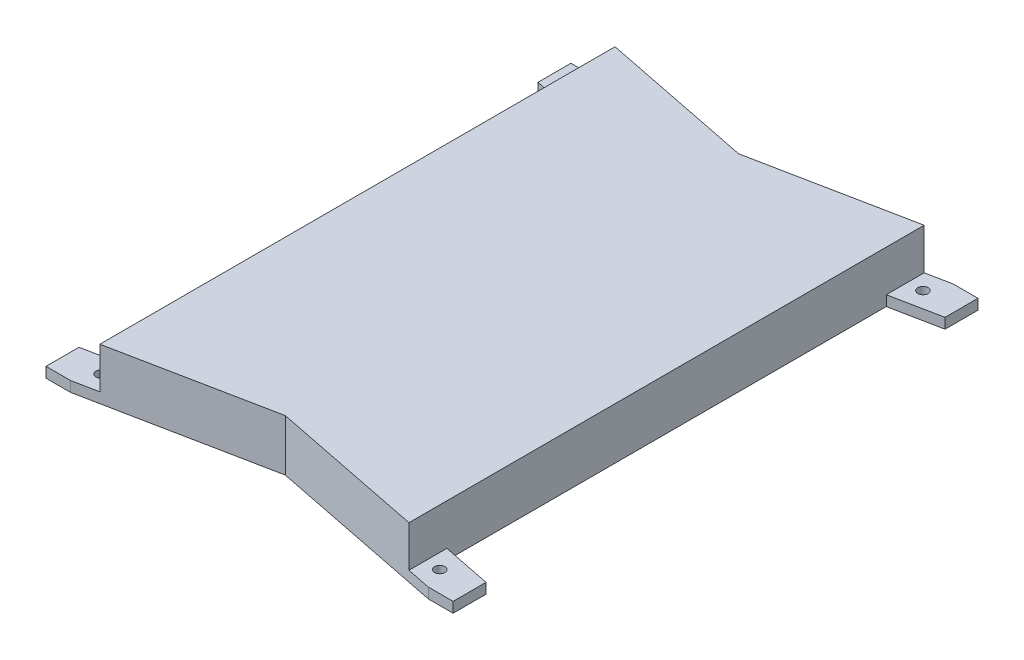
ISO-10303-21;
HEADER;
FILE_DESCRIPTION(('STEP AP214'),'2;1');
FILE_NAME('part.step','',(''),(''),'','','');
FILE_SCHEMA(('AUTOMOTIVE_DESIGN { 1 0 10303 214 1 1 1 1 }'));
ENDSEC;
DATA;
#1=APPLICATION_CONTEXT('core data for automotive mechanical design processes');
#2=APPLICATION_PROTOCOL_DEFINITION('international standard','automotive_design',2000,#1);
#3=PRODUCT_CONTEXT('',#1,'mechanical');
#4=PRODUCT('Part','Part','',(#3));
#5=PRODUCT_RELATED_PRODUCT_CATEGORY('part','',(#4));
#6=PRODUCT_DEFINITION_FORMATION('','',#4);
#7=PRODUCT_DEFINITION_CONTEXT('part definition',#1,'design');
#8=PRODUCT_DEFINITION('design','',#6,#7);
#9=PRODUCT_DEFINITION_SHAPE('','',#8);
#10=(LENGTH_UNIT() NAMED_UNIT(*) SI_UNIT(.MILLI.,.METRE.));
#11=(NAMED_UNIT(*) PLANE_ANGLE_UNIT() SI_UNIT($,.RADIAN.));
#12=(NAMED_UNIT(*) SI_UNIT($,.STERADIAN.) SOLID_ANGLE_UNIT());
#13=UNCERTAINTY_MEASURE_WITH_UNIT(LENGTH_MEASURE(1.E-05),#10,'distance_accuracy_value','');
#14=(GEOMETRIC_REPRESENTATION_CONTEXT(3) GLOBAL_UNCERTAINTY_ASSIGNED_CONTEXT((#13)) GLOBAL_UNIT_ASSIGNED_CONTEXT((#10,
#11,#12)) REPRESENTATION_CONTEXT('',''));
#15=CARTESIAN_POINT('',(0.,0.,0.));
#16=DIRECTION('',(0.,0.,1.));
#17=DIRECTION('',(1.,0.,0.));
#18=AXIS2_PLACEMENT_3D('',#15,#16,#17);
#19=CARTESIAN_POINT('',(-73.,0.,0.));
#20=DIRECTION('',(-1.,0.,0.));
#21=DIRECTION('',(0.,0.,1.));
#22=AXIS2_PLACEMENT_3D('',#19,#20,#21);
#23=PLANE('',#22);
#24=DIRECTION('',(0.,0.,-1.));
#25=VECTOR('',#24,1.);
#26=CARTESIAN_POINT('',(-73.,20.,0.));
#27=LINE('',#26,#25);
#28=CARTESIAN_POINT('',(-73.,20.,122.560392194563));
#29=VERTEX_POINT('',#28);
#30=CARTESIAN_POINT('',(-73.,20.,-122.560392194563));
#31=VERTEX_POINT('',#30);
#32=EDGE_CURVE('E243',#29,#31,#27,.T.);
#33=ORIENTED_EDGE('',*,*,#32,.F.);
#34=DIRECTION('',(0.,1.,0.));
#35=VECTOR('',#34,1.);
#36=CARTESIAN_POINT('',(-73.,0.,122.560392194563));
#37=LINE('',#36,#35);
#38=CARTESIAN_POINT('',(-73.,0.,122.560392194563));
#39=VERTEX_POINT('',#38);
#40=EDGE_CURVE('E228',#39,#29,#37,.T.);
#41=ORIENTED_EDGE('',*,*,#40,.F.);
#42=DIRECTION('',(0.,0.,1.));
#43=VECTOR('',#42,1.);
#44=CARTESIAN_POINT('',(-73.,0.,0.));
#45=LINE('',#44,#43);
#46=CARTESIAN_POINT('',(-73.,0.,-122.560392194563));
#47=VERTEX_POINT('',#46);
#48=EDGE_CURVE('E312',#47,#39,#45,.T.);
#49=ORIENTED_EDGE('',*,*,#48,.F.);
#50=DIRECTION('',(0.,1.,0.));
#51=VECTOR('',#50,1.);
#52=CARTESIAN_POINT('',(-73.,0.,-122.560392194563));
#53=LINE('',#52,#51);
#54=EDGE_CURVE('E244',#47,#31,#53,.T.);
#55=ORIENTED_EDGE('',*,*,#54,.T.);
#56=EDGE_LOOP('',(#33,#41,#49,#55));
#57=FACE_BOUND('',#56,.T.);
#58=ADVANCED_FACE('F42',(#57),#23,.F.);
#59=CARTESIAN_POINT('',(20.7616138835697,0.,-103.808069417849));
#60=DIRECTION('',(0.196116135138183,0.,-0.98058067569092));
#61=DIRECTION('',(-0.98058067569092,0.,-0.196116135138183));
#62=AXIS2_PLACEMENT_3D('',#59,#60,#61);
#63=PLANE('',#62);
#64=DIRECTION('',(0.98058067569092,0.,0.196116135138183));
#65=VECTOR('',#64,1.);
#66=CARTESIAN_POINT('',(20.7616138835697,20.,-103.808069417849));
#67=LINE('',#66,#65);
#68=CARTESIAN_POINT('',(0.,20.,-107.960392194563));
#69=VERTEX_POINT('',#68);
#70=EDGE_CURVE('E58',#31,#69,#67,.T.);
#71=ORIENTED_EDGE('',*,*,#70,.F.);
#72=ORIENTED_EDGE('',*,*,#54,.F.);
#73=DIRECTION('',(-0.98058067569092,0.,-0.196116135138183));
#74=VECTOR('',#73,1.);
#75=CARTESIAN_POINT('',(20.7616138835697,0.,-103.808069417849));
#76=LINE('',#75,#74);
#77=CARTESIAN_POINT('',(0.,0.,-107.960392194563));
#78=VERTEX_POINT('',#77);
#79=EDGE_CURVE('E240',#78,#47,#76,.T.);
#80=ORIENTED_EDGE('',*,*,#79,.F.);
#81=DIRECTION('',(0.,1.,0.));
#82=VECTOR('',#81,1.);
#83=CARTESIAN_POINT('',(0.,0.,-107.960392194563));
#84=LINE('',#83,#82);
#85=EDGE_CURVE('E361',#78,#69,#84,.T.);
#86=ORIENTED_EDGE('',*,*,#85,.T.);
#87=EDGE_LOOP('',(#71,#72,#80,#86));
#88=FACE_BOUND('',#87,.T.);
#89=ADVANCED_FACE('F660',(#88),#63,.F.);
#90=CARTESIAN_POINT('',(-20.7616138835697,0.,-103.808069417849));
#91=DIRECTION('',(-0.196116135138183,0.,-0.98058067569092));
#92=DIRECTION('',(-0.98058067569092,0.,0.196116135138183));
#93=AXIS2_PLACEMENT_3D('',#90,#91,#92);
#94=PLANE('',#93);
#95=DIRECTION('',(0.98058067569092,0.,-0.196116135138183));
#96=VECTOR('',#95,1.);
#97=CARTESIAN_POINT('',(-20.7616138835697,20.,-103.808069417849));
#98=LINE('',#97,#96);
#99=CARTESIAN_POINT('',(72.9999999999999,20.,-122.560392194563));
#100=VERTEX_POINT('',#99);
#101=EDGE_CURVE('E66',#69,#100,#98,.T.);
#102=ORIENTED_EDGE('',*,*,#101,.F.);
#103=ORIENTED_EDGE('',*,*,#85,.F.);
#104=DIRECTION('',(-0.98058067569092,0.,0.196116135138183));
#105=VECTOR('',#104,1.);
#106=CARTESIAN_POINT('',(-20.7616138835697,0.,-103.808069417849));
#107=LINE('',#106,#105);
#108=CARTESIAN_POINT('',(72.9999999999999,0.,-122.560392194563));
#109=VERTEX_POINT('',#108);
#110=EDGE_CURVE('E351',#109,#78,#107,.T.);
#111=ORIENTED_EDGE('',*,*,#110,.F.);
#112=DIRECTION('',(0.,1.,0.));
#113=VECTOR('',#112,1.);
#114=CARTESIAN_POINT('',(72.9999999999999,0.,-122.560392194563));
#115=LINE('',#114,#113);
#116=EDGE_CURVE('E364',#109,#100,#115,.T.);
#117=ORIENTED_EDGE('',*,*,#116,.T.);
#118=EDGE_LOOP('',(#102,#103,#111,#117));
#119=FACE_BOUND('',#118,.T.);
#120=ADVANCED_FACE('F665',(#119),#94,.F.);
#121=CARTESIAN_POINT('',(73.,0.,0.));
#122=DIRECTION('',(-1.,0.,0.));
#123=DIRECTION('',(0.,0.,1.));
#124=AXIS2_PLACEMENT_3D('',#121,#122,#123);
#125=PLANE('',#124);
#126=DIRECTION('',(0.,1.,0.));
#127=VECTOR('',#126,1.);
#128=CARTESIAN_POINT('',(73.,0.,122.560392194563));
#129=LINE('',#128,#127);
#130=CARTESIAN_POINT('',(73.,0.,122.560392194563));
#131=VERTEX_POINT('',#130);
#132=CARTESIAN_POINT('',(73.,20.,122.560392194563));
#133=VERTEX_POINT('',#132);
#134=EDGE_CURVE('E367',#131,#133,#129,.T.);
#135=ORIENTED_EDGE('',*,*,#134,.T.);
#136=DIRECTION('',(0.,0.,-1.));
#137=VECTOR('',#136,1.);
#138=CARTESIAN_POINT('',(73.,20.,0.));
#139=LINE('',#138,#137);
#140=EDGE_CURVE('E253',#133,#100,#139,.T.);
#141=ORIENTED_EDGE('',*,*,#140,.T.);
#142=ORIENTED_EDGE('',*,*,#116,.F.);
#143=DIRECTION('',(0.,0.,1.));
#144=VECTOR('',#143,1.);
#145=CARTESIAN_POINT('',(73.,0.,0.));
#146=LINE('',#145,#144);
#147=EDGE_CURVE('E348',#109,#131,#146,.T.);
#148=ORIENTED_EDGE('',*,*,#147,.T.);
#149=EDGE_LOOP('',(#135,#141,#142,#148));
#150=FACE_BOUND('',#149,.T.);
#151=ADVANCED_FACE('F855',(#150),#125,.T.);
#152=CARTESIAN_POINT('',(-20.7616138835698,0.,103.808069417849));
#153=DIRECTION('',(-0.196116135138185,0.,0.98058067569092));
#154=DIRECTION('',(0.98058067569092,0.,0.196116135138185));
#155=AXIS2_PLACEMENT_3D('',#152,#153,#154);
#156=PLANE('',#155);
#157=DIRECTION('',(-0.98058067569092,0.,-0.196116135138185));
#158=VECTOR('',#157,1.);
#159=CARTESIAN_POINT('',(-20.7616138835698,20.,103.808069417849));
#160=LINE('',#159,#158);
#161=CARTESIAN_POINT('',(0.,20.,107.960392194563));
#162=VERTEX_POINT('',#161);
#163=EDGE_CURVE('E252',#133,#162,#160,.T.);
#164=ORIENTED_EDGE('',*,*,#163,.F.);
#165=ORIENTED_EDGE('',*,*,#134,.F.);
#166=DIRECTION('',(0.98058067569092,0.,0.196116135138185));
#167=VECTOR('',#166,1.);
#168=CARTESIAN_POINT('',(-20.7616138835698,0.,103.808069417849));
#169=LINE('',#168,#167);
#170=CARTESIAN_POINT('',(0.,0.,107.960392194563));
#171=VERTEX_POINT('',#170);
#172=EDGE_CURVE('E344',#171,#131,#169,.T.);
#173=ORIENTED_EDGE('',*,*,#172,.F.);
#174=DIRECTION('',(0.,1.,0.));
#175=VECTOR('',#174,1.);
#176=CARTESIAN_POINT('',(0.,0.,107.960392194563));
#177=LINE('',#176,#175);
#178=EDGE_CURVE('E239',#171,#162,#177,.T.);
#179=ORIENTED_EDGE('',*,*,#178,.T.);
#180=EDGE_LOOP('',(#164,#165,#173,#179));
#181=FACE_BOUND('',#180,.T.);
#182=ADVANCED_FACE('F866',(#181),#156,.F.);
#183=CARTESIAN_POINT('',(20.7616138835697,0.,103.808069417849));
#184=DIRECTION('',(0.196116135138183,0.,0.98058067569092));
#185=DIRECTION('',(0.98058067569092,0.,-0.196116135138183));
#186=AXIS2_PLACEMENT_3D('',#183,#184,#185);
#187=PLANE('',#186);
#188=DIRECTION('',(-0.98058067569092,0.,0.196116135138183));
#189=VECTOR('',#188,1.);
#190=CARTESIAN_POINT('',(20.7616138835697,20.,103.808069417849));
#191=LINE('',#190,#189);
#192=EDGE_CURVE('E11',#162,#29,#191,.T.);
#193=ORIENTED_EDGE('',*,*,#192,.F.);
#194=ORIENTED_EDGE('',*,*,#178,.F.);
#195=DIRECTION('',(0.98058067569092,0.,-0.196116135138183));
#196=VECTOR('',#195,1.);
#197=CARTESIAN_POINT('',(20.7616138835697,0.,103.808069417849));
#198=LINE('',#197,#196);
#199=EDGE_CURVE('E234',#39,#171,#198,.T.);
#200=ORIENTED_EDGE('',*,*,#199,.F.);
#201=ORIENTED_EDGE('',*,*,#40,.T.);
#202=EDGE_LOOP('',(#193,#194,#200,#201));
#203=FACE_BOUND('',#202,.T.);
#204=ADVANCED_FACE('F230',(#203),#187,.F.);
#205=CARTESIAN_POINT('',(0.,5.,0.));
#206=DIRECTION('',(0.,1.,0.));
#207=DIRECTION('',(0.,0.,1.));
#208=AXIS2_PLACEMENT_3D('',#205,#206,#207);
#209=PLANE('',#208);
#210=DIRECTION('',(0.,0.,-1.));
#211=VECTOR('',#210,1.);
#212=CARTESIAN_POINT('',(74.9999999999999,5.,-125.));
#213=LINE('',#212,#211);
#214=CARTESIAN_POINT('',(75.,5.,125.));
#215=VERTEX_POINT('',#214);
#216=CARTESIAN_POINT('',(75.,5.,106.6));
#217=VERTEX_POINT('',#216);
#218=EDGE_CURVE('E271',#215,#217,#213,.T.);
#219=ORIENTED_EDGE('',*,*,#218,.F.);
#220=DIRECTION('',(0.98058067569092,0.,0.196116135138184));
#221=VECTOR('',#220,1.);
#222=CARTESIAN_POINT('',(0.,5.,110.));
#223=LINE('',#222,#221);
#224=CARTESIAN_POINT('',(86.766968108291,5.,127.353393621658));
#225=VERTEX_POINT('',#224);
#226=EDGE_CURVE('E398',#215,#225,#223,.T.);
#227=ORIENTED_EDGE('',*,*,#226,.T.);
#228=DIRECTION('',(1.,0.,0.));
#229=VECTOR('',#228,1.);
#230=CARTESIAN_POINT('',(86.766968108291,5.,127.353393621658));
#231=LINE('',#230,#229);
#232=CARTESIAN_POINT('',(98.766968108291,5.,127.353393621658));
#233=VERTEX_POINT('',#232);
#234=EDGE_CURVE('E401',#225,#233,#231,.T.);
#235=ORIENTED_EDGE('',*,*,#234,.T.);
#236=DIRECTION('',(0.,0.,-1.));
#237=VECTOR('',#236,1.);
#238=CARTESIAN_POINT('',(98.766968108291,5.,127.353393621658));
#239=LINE('',#238,#237);
#240=CARTESIAN_POINT('',(98.766968108291,5.,111.353393621658));
#241=VERTEX_POINT('',#240);
#242=EDGE_CURVE('E404',#233,#241,#239,.T.);
#243=ORIENTED_EDGE('',*,*,#242,.T.);
#244=DIRECTION('',(-0.980580675690919,0.,-0.196116135138188));
#245=VECTOR('',#244,1.);
#246=CARTESIAN_POINT('',(98.766968108291,5.,111.353393621658));
#247=LINE('',#246,#245);
#248=EDGE_CURVE('E407',#241,#217,#247,.T.);
#249=ORIENTED_EDGE('',*,*,#248,.T.);
#250=EDGE_LOOP('',(#219,#227,#235,#243,#249));
#251=FACE_BOUND('',#250,.T.);
#252=CARTESIAN_POINT('',(82.1768461758862,5.,117.235369235177));
#253=DIRECTION('',(0.,1.,0.));
#254=DIRECTION('',(0.,0.,1.));
#255=AXIS2_PLACEMENT_3D('',#252,#253,#254);
#256=CIRCLE('',#255,2.50000000000001);
#257=CARTESIAN_POINT('',(82.1768461758862,5.,119.735369235177));
#258=VERTEX_POINT('',#257);
#259=EDGE_CURVE('E321',#258,#258,#256,.T.);
#260=ORIENTED_EDGE('',*,*,#259,.F.);
#261=EDGE_LOOP('',(#260));
#262=FACE_BOUND('',#261,.T.);
#263=ADVANCED_FACE('F627',(#251,#262),#209,.T.);
#264=CARTESIAN_POINT('',(75.,5.,-106.6));
#265=VERTEX_POINT('',#264);
#266=CARTESIAN_POINT('',(74.9999999999999,5.,-125.));
#267=VERTEX_POINT('',#266);
#268=EDGE_CURVE('E51',#265,#267,#213,.T.);
#269=ORIENTED_EDGE('',*,*,#268,.F.);
#270=DIRECTION('',(0.98058067569092,0.,-0.196116135138183));
#271=VECTOR('',#270,1.);
#272=CARTESIAN_POINT('',(98.7669681082911,5.,-111.353393621658));
#273=LINE('',#272,#271);
#274=CARTESIAN_POINT('',(98.7669681082911,5.,-111.353393621658));
#275=VERTEX_POINT('',#274);
#276=EDGE_CURVE('E410',#265,#275,#273,.T.);
#277=ORIENTED_EDGE('',*,*,#276,.T.);
#278=DIRECTION('',(0.,0.,-1.));
#279=VECTOR('',#278,1.);
#280=CARTESIAN_POINT('',(98.7669681082911,5.,-127.353393621658));
#281=LINE('',#280,#279);
#282=CARTESIAN_POINT('',(98.7669681082911,5.,-127.353393621658));
#283=VERTEX_POINT('',#282);
#284=EDGE_CURVE('E413',#275,#283,#281,.T.);
#285=ORIENTED_EDGE('',*,*,#284,.T.);
#286=DIRECTION('',(-1.,0.,0.));
#287=VECTOR('',#286,1.);
#288=CARTESIAN_POINT('',(86.7669681082911,5.,-127.353393621658));
#289=LINE('',#288,#287);
#290=CARTESIAN_POINT('',(86.7669681082911,5.,-127.353393621658));
#291=VERTEX_POINT('',#290);
#292=EDGE_CURVE('E416',#283,#291,#289,.T.);
#293=ORIENTED_EDGE('',*,*,#292,.T.);
#294=DIRECTION('',(-0.980580675690921,0.,0.196116135138179));
#295=VECTOR('',#294,1.);
#296=CARTESIAN_POINT('',(75.,5.,-125.));
#297=LINE('',#296,#295);
#298=EDGE_CURVE('E419',#291,#267,#297,.T.);
#299=ORIENTED_EDGE('',*,*,#298,.T.);
#300=EDGE_LOOP('',(#269,#277,#285,#293,#299));
#301=FACE_BOUND('',#300,.T.);
#302=CARTESIAN_POINT('',(82.1768461758862,5.,-117.235369235177));
#303=DIRECTION('',(0.,1.,0.));
#304=DIRECTION('',(0.,0.,1.));
#305=AXIS2_PLACEMENT_3D('',#302,#303,#304);
#306=CIRCLE('',#305,2.50000000000001);
#307=CARTESIAN_POINT('',(82.1768461758862,5.,-114.735369235177));
#308=VERTEX_POINT('',#307);
#309=EDGE_CURVE('E307',#308,#308,#306,.F.);
#310=ORIENTED_EDGE('',*,*,#309,.T.);
#311=EDGE_LOOP('',(#310));
#312=FACE_BOUND('',#311,.T.);
#313=ADVANCED_FACE('F565',(#301,#312),#209,.T.);
#314=DIRECTION('',(0.,0.,1.));
#315=VECTOR('',#314,1.);
#316=CARTESIAN_POINT('',(-75.,5.,-125.));
#317=LINE('',#316,#315);
#318=CARTESIAN_POINT('',(-75.,5.,-125.));
#319=VERTEX_POINT('',#318);
#320=CARTESIAN_POINT('',(-75.,5.,-106.6));
#321=VERTEX_POINT('',#320);
#322=EDGE_CURVE('E247',#319,#321,#317,.T.);
#323=ORIENTED_EDGE('',*,*,#322,.F.);
#324=DIRECTION('',(-0.980580675690921,0.,-0.196116135138177));
#325=VECTOR('',#324,1.);
#326=CARTESIAN_POINT('',(-75.,5.,-125.));
#327=LINE('',#326,#325);
#328=CARTESIAN_POINT('',(-86.7669681082911,5.,-127.353393621658));
#329=VERTEX_POINT('',#328);
#330=EDGE_CURVE('E372',#319,#329,#327,.T.);
#331=ORIENTED_EDGE('',*,*,#330,.T.);
#332=DIRECTION('',(-1.,0.,0.));
#333=VECTOR('',#332,1.);
#334=CARTESIAN_POINT('',(-86.7669681082911,5.,-127.353393621658));
#335=LINE('',#334,#333);
#336=CARTESIAN_POINT('',(-98.7669681082911,5.,-127.353393621658));
#337=VERTEX_POINT('',#336);
#338=EDGE_CURVE('E375',#329,#337,#335,.T.);
#339=ORIENTED_EDGE('',*,*,#338,.T.);
#340=DIRECTION('',(0.,0.,1.));
#341=VECTOR('',#340,1.);
#342=CARTESIAN_POINT('',(-98.7669681082911,5.,-127.353393621658));
#343=LINE('',#342,#341);
#344=CARTESIAN_POINT('',(-98.7669681082911,5.,-111.353393621658));
#345=VERTEX_POINT('',#344);
#346=EDGE_CURVE('E379',#337,#345,#343,.T.);
#347=ORIENTED_EDGE('',*,*,#346,.T.);
#348=DIRECTION('',(0.980580675690921,0.,0.196116135138183));
#349=VECTOR('',#348,1.);
#350=CARTESIAN_POINT('',(-98.7669681082911,5.,-111.353393621658));
#351=LINE('',#350,#349);
#352=EDGE_CURVE('E382',#345,#321,#351,.T.);
#353=ORIENTED_EDGE('',*,*,#352,.T.);
#354=EDGE_LOOP('',(#323,#331,#339,#347,#353));
#355=FACE_BOUND('',#354,.T.);
#356=CARTESIAN_POINT('',(-82.1768461758863,5.,-117.235369235177));
#357=DIRECTION('',(0.,1.,0.));
#358=DIRECTION('',(0.,0.,1.));
#359=AXIS2_PLACEMENT_3D('',#356,#357,#358);
#360=CIRCLE('',#359,2.50000000000001);
#361=CARTESIAN_POINT('',(-82.1768461758863,5.,-114.735369235177));
#362=VERTEX_POINT('',#361);
#363=EDGE_CURVE('E329',#362,#362,#360,.T.);
#364=ORIENTED_EDGE('',*,*,#363,.F.);
#365=EDGE_LOOP('',(#364));
#366=FACE_BOUND('',#365,.T.);
#367=ADVANCED_FACE('F583',(#355,#366),#209,.T.);
#368=CARTESIAN_POINT('',(-75.,5.,106.6));
#369=VERTEX_POINT('',#368);
#370=CARTESIAN_POINT('',(-75.,5.,125.));
#371=VERTEX_POINT('',#370);
#372=EDGE_CURVE('E292',#369,#371,#317,.T.);
#373=ORIENTED_EDGE('',*,*,#372,.F.);
#374=DIRECTION('',(-0.980580675690921,0.,0.196116135138183));
#375=VECTOR('',#374,1.);
#376=CARTESIAN_POINT('',(-98.7669681082911,5.,111.353393621658));
#377=LINE('',#376,#375);
#378=CARTESIAN_POINT('',(-98.7669681082911,5.,111.353393621658));
#379=VERTEX_POINT('',#378);
#380=EDGE_CURVE('E385',#369,#379,#377,.T.);
#381=ORIENTED_EDGE('',*,*,#380,.T.);
#382=DIRECTION('',(0.,0.,1.));
#383=VECTOR('',#382,1.);
#384=CARTESIAN_POINT('',(-98.7669681082911,5.,127.353393621658));
#385=LINE('',#384,#383);
#386=CARTESIAN_POINT('',(-98.7669681082911,5.,127.353393621658));
#387=VERTEX_POINT('',#386);
#388=EDGE_CURVE('E388',#379,#387,#385,.T.);
#389=ORIENTED_EDGE('',*,*,#388,.T.);
#390=DIRECTION('',(1.,0.,0.));
#391=VECTOR('',#390,1.);
#392=CARTESIAN_POINT('',(-86.7669681082911,5.,127.353393621658));
#393=LINE('',#392,#391);
#394=CARTESIAN_POINT('',(-86.7669681082911,5.,127.353393621658));
#395=VERTEX_POINT('',#394);
#396=EDGE_CURVE('E391',#387,#395,#393,.T.);
#397=ORIENTED_EDGE('',*,*,#396,.T.);
#398=DIRECTION('',(0.980580675690921,0.,-0.196116135138177));
#399=VECTOR('',#398,1.);
#400=CARTESIAN_POINT('',(-75.,5.,125.));
#401=LINE('',#400,#399);
#402=EDGE_CURVE('E394',#395,#371,#401,.T.);
#403=ORIENTED_EDGE('',*,*,#402,.T.);
#404=EDGE_LOOP('',(#373,#381,#389,#397,#403));
#405=FACE_BOUND('',#404,.T.);
#406=CARTESIAN_POINT('',(-82.1768461758862,5.,117.235369235177));
#407=DIRECTION('',(0.,1.,0.));
#408=DIRECTION('',(0.,0.,1.));
#409=AXIS2_PLACEMENT_3D('',#406,#407,#408);
#410=CIRCLE('',#409,2.50000000000001);
#411=CARTESIAN_POINT('',(-82.1768461758862,5.,119.735369235177));
#412=VERTEX_POINT('',#411);
#413=EDGE_CURVE('E313',#412,#412,#410,.F.);
#414=ORIENTED_EDGE('',*,*,#413,.T.);
#415=EDGE_LOOP('',(#414));
#416=FACE_BOUND('',#415,.T.);
#417=ADVANCED_FACE('F611',(#405,#416),#209,.T.);
#418=CARTESIAN_POINT('',(0.,0.,0.));
#419=DIRECTION('',(0.,1.,0.));
#420=DIRECTION('',(0.,0.,1.));
#421=AXIS2_PLACEMENT_3D('',#418,#419,#420);
#422=PLANE('',#421);
#423=CARTESIAN_POINT('',(-82.1768461758863,0.,-117.235369235177));
#424=DIRECTION('',(0.,1.,0.));
#425=DIRECTION('',(0.,0.,1.));
#426=AXIS2_PLACEMENT_3D('',#423,#424,#425);
#427=CIRCLE('',#426,2.50000000000001);
#428=CARTESIAN_POINT('',(-82.1768461758863,0.,-114.735369235177));
#429=VERTEX_POINT('',#428);
#430=EDGE_CURVE('E325',#429,#429,#427,.T.);
#431=ORIENTED_EDGE('',*,*,#430,.T.);
#432=EDGE_LOOP('',(#431));
#433=FACE_BOUND('',#432,.T.);
#434=CARTESIAN_POINT('',(82.1768461758862,0.,117.235369235177));
#435=DIRECTION('',(0.,1.,0.));
#436=DIRECTION('',(0.,0.,1.));
#437=AXIS2_PLACEMENT_3D('',#434,#435,#436);
#438=CIRCLE('',#437,2.50000000000001);
#439=CARTESIAN_POINT('',(82.1768461758862,0.,119.735369235177));
#440=VERTEX_POINT('',#439);
#441=EDGE_CURVE('E317',#440,#440,#438,.T.);
#442=ORIENTED_EDGE('',*,*,#441,.T.);
#443=EDGE_LOOP('',(#442));
#444=FACE_BOUND('',#443,.T.);
#445=ORIENTED_EDGE('',*,*,#79,.T.);
#446=ORIENTED_EDGE('',*,*,#48,.T.);
#447=ORIENTED_EDGE('',*,*,#199,.T.);
#448=ORIENTED_EDGE('',*,*,#172,.T.);
#449=ORIENTED_EDGE('',*,*,#147,.F.);
#450=ORIENTED_EDGE('',*,*,#110,.T.);
#451=EDGE_LOOP('',(#445,#446,#447,#448,#449,#450));
#452=FACE_BOUND('',#451,.T.);
#453=DIRECTION('',(-1.,0.,0.));
#454=VECTOR('',#453,1.);
#455=CARTESIAN_POINT('',(-86.7669681082911,0.,-127.353393621658));
#456=LINE('',#455,#454);
#457=CARTESIAN_POINT('',(-86.7669681082911,0.,-127.353393621658));
#458=VERTEX_POINT('',#457);
#459=CARTESIAN_POINT('',(-98.7669681082911,0.,-127.353393621658));
#460=VERTEX_POINT('',#459);
#461=EDGE_CURVE('E360',#458,#460,#456,.T.);
#462=ORIENTED_EDGE('',*,*,#461,.F.);
#463=DIRECTION('',(-0.98058067569092,0.,-0.196116135138184));
#464=VECTOR('',#463,1.);
#465=CARTESIAN_POINT('',(0.,0.,-110.));
#466=LINE('',#465,#464);
#467=CARTESIAN_POINT('',(0.,0.,-110.));
#468=VERTEX_POINT('',#467);
#469=EDGE_CURVE('E376',#468,#458,#466,.T.);
#470=ORIENTED_EDGE('',*,*,#469,.F.);
#471=DIRECTION('',(-0.98058067569092,0.,0.196116135138184));
#472=VECTOR('',#471,1.);
#473=CARTESIAN_POINT('',(75.,0.,-125.));
#474=LINE('',#473,#472);
#475=CARTESIAN_POINT('',(86.7669681082911,0.,-127.353393621658));
#476=VERTEX_POINT('',#475);
#477=EDGE_CURVE('E474',#476,#468,#474,.T.);
#478=ORIENTED_EDGE('',*,*,#477,.F.);
#479=DIRECTION('',(-1.,0.,0.));
#480=VECTOR('',#479,1.);
#481=CARTESIAN_POINT('',(86.7669681082911,0.,-127.353393621658));
#482=LINE('',#481,#480);
#483=CARTESIAN_POINT('',(98.7669681082911,0.,-127.353393621658));
#484=VERTEX_POINT('',#483);
#485=EDGE_CURVE('E470',#484,#476,#482,.T.);
#486=ORIENTED_EDGE('',*,*,#485,.F.);
#487=DIRECTION('',(0.,0.,-1.));
#488=VECTOR('',#487,1.);
#489=CARTESIAN_POINT('',(98.7669681082911,0.,-127.353393621658));
#490=LINE('',#489,#488);
#491=CARTESIAN_POINT('',(98.7669681082911,0.,-111.353393621658));
#492=VERTEX_POINT('',#491);
#493=EDGE_CURVE('E467',#492,#484,#490,.T.);
#494=ORIENTED_EDGE('',*,*,#493,.F.);
#495=DIRECTION('',(0.98058067569092,0.,-0.196116135138183));
#496=VECTOR('',#495,1.);
#497=CARTESIAN_POINT('',(98.7669681082911,0.,-111.353393621658));
#498=LINE('',#497,#496);
#499=CARTESIAN_POINT('',(75.,0.,-106.6));
#500=VERTEX_POINT('',#499);
#501=EDGE_CURVE('E464',#500,#492,#498,.T.);
#502=ORIENTED_EDGE('',*,*,#501,.F.);
#503=DIRECTION('',(0.,0.,-1.));
#504=VECTOR('',#503,1.);
#505=CARTESIAN_POINT('',(75.,0.,106.6));
#506=LINE('',#505,#504);
#507=CARTESIAN_POINT('',(75.,0.,106.6));
#508=VERTEX_POINT('',#507);
#509=EDGE_CURVE('E461',#508,#500,#506,.T.);
#510=ORIENTED_EDGE('',*,*,#509,.F.);
#511=DIRECTION('',(-0.980580675690919,0.,-0.196116135138188));
#512=VECTOR('',#511,1.);
#513=CARTESIAN_POINT('',(98.766968108291,0.,111.353393621658));
#514=LINE('',#513,#512);
#515=CARTESIAN_POINT('',(98.766968108291,0.,111.353393621658));
#516=VERTEX_POINT('',#515);
#517=EDGE_CURVE('E458',#516,#508,#514,.T.);
#518=ORIENTED_EDGE('',*,*,#517,.F.);
#519=DIRECTION('',(0.,0.,-1.));
#520=VECTOR('',#519,1.);
#521=CARTESIAN_POINT('',(98.766968108291,0.,127.353393621658));
#522=LINE('',#521,#520);
#523=CARTESIAN_POINT('',(98.766968108291,0.,127.353393621658));
#524=VERTEX_POINT('',#523);
#525=EDGE_CURVE('E455',#524,#516,#522,.T.);
#526=ORIENTED_EDGE('',*,*,#525,.F.);
#527=DIRECTION('',(1.,0.,0.));
#528=VECTOR('',#527,1.);
#529=CARTESIAN_POINT('',(86.766968108291,0.,127.353393621658));
#530=LINE('',#529,#528);
#531=CARTESIAN_POINT('',(86.766968108291,0.,127.353393621658));
#532=VERTEX_POINT('',#531);
#533=EDGE_CURVE('E452',#532,#524,#530,.T.);
#534=ORIENTED_EDGE('',*,*,#533,.F.);
#535=DIRECTION('',(0.980580675690919,0.,0.196116135138188));
#536=VECTOR('',#535,1.);
#537=CARTESIAN_POINT('',(75.,0.,125.));
#538=LINE('',#537,#536);
#539=CARTESIAN_POINT('',(0.,0.,110.));
#540=VERTEX_POINT('',#539);
#541=EDGE_CURVE('E449',#540,#532,#538,.T.);
#542=ORIENTED_EDGE('',*,*,#541,.F.);
#543=DIRECTION('',(0.98058067569092,0.,-0.196116135138184));
#544=VECTOR('',#543,1.);
#545=CARTESIAN_POINT('',(-75.,0.,125.));
#546=LINE('',#545,#544);
#547=CARTESIAN_POINT('',(-86.7669681082911,0.,127.353393621658));
#548=VERTEX_POINT('',#547);
#549=EDGE_CURVE('E445',#548,#540,#546,.T.);
#550=ORIENTED_EDGE('',*,*,#549,.F.);
#551=DIRECTION('',(1.,0.,0.));
#552=VECTOR('',#551,1.);
#553=CARTESIAN_POINT('',(-86.7669681082911,0.,127.353393621658));
#554=LINE('',#553,#552);
#555=CARTESIAN_POINT('',(-98.7669681082911,0.,127.353393621658));
#556=VERTEX_POINT('',#555);
#557=EDGE_CURVE('E441',#556,#548,#554,.T.);
#558=ORIENTED_EDGE('',*,*,#557,.F.);
#559=DIRECTION('',(0.,0.,1.));
#560=VECTOR('',#559,1.);
#561=CARTESIAN_POINT('',(-98.7669681082911,0.,127.353393621658));
#562=LINE('',#561,#560);
#563=CARTESIAN_POINT('',(-98.7669681082911,0.,111.353393621658));
#564=VERTEX_POINT('',#563);
#565=EDGE_CURVE('E438',#564,#556,#562,.T.);
#566=ORIENTED_EDGE('',*,*,#565,.F.);
#567=DIRECTION('',(-0.980580675690921,0.,0.196116135138183));
#568=VECTOR('',#567,1.);
#569=CARTESIAN_POINT('',(-98.7669681082911,0.,111.353393621658));
#570=LINE('',#569,#568);
#571=CARTESIAN_POINT('',(-75.,0.,106.6));
#572=VERTEX_POINT('',#571);
#573=EDGE_CURVE('E435',#572,#564,#570,.T.);
#574=ORIENTED_EDGE('',*,*,#573,.F.);
#575=DIRECTION('',(0.,0.,1.));
#576=VECTOR('',#575,1.);
#577=CARTESIAN_POINT('',(-75.,0.,-106.6));
#578=LINE('',#577,#576);
#579=CARTESIAN_POINT('',(-75.,0.,-106.6));
#580=VERTEX_POINT('',#579);
#581=EDGE_CURVE('E432',#580,#572,#578,.T.);
#582=ORIENTED_EDGE('',*,*,#581,.F.);
#583=DIRECTION('',(0.980580675690921,0.,0.196116135138183));
#584=VECTOR('',#583,1.);
#585=CARTESIAN_POINT('',(-98.7669681082911,0.,-111.353393621658));
#586=LINE('',#585,#584);
#587=CARTESIAN_POINT('',(-98.7669681082911,0.,-111.353393621658));
#588=VERTEX_POINT('',#587);
#589=EDGE_CURVE('E429',#588,#580,#586,.T.);
#590=ORIENTED_EDGE('',*,*,#589,.F.);
#591=DIRECTION('',(0.,0.,1.));
#592=VECTOR('',#591,1.);
#593=CARTESIAN_POINT('',(-98.7669681082911,0.,-127.353393621658));
#594=LINE('',#593,#592);
#595=EDGE_CURVE('E426',#460,#588,#594,.T.);
#596=ORIENTED_EDGE('',*,*,#595,.F.);
#597=EDGE_LOOP('',(#462,#470,#478,#486,#494,#502,#510,#518,#526,#534,#542,#550,#558,#566,#574,
#582,#590,#596));
#598=FACE_BOUND('',#597,.T.);
#599=CARTESIAN_POINT('',(-82.1768461758862,0.,117.235369235177));
#600=DIRECTION('',(0.,1.,0.));
#601=DIRECTION('',(0.,0.,1.));
#602=AXIS2_PLACEMENT_3D('',#599,#600,#601);
#603=CIRCLE('',#602,2.50000000000001);
#604=CARTESIAN_POINT('',(-82.1768461758862,0.,119.735369235177));
#605=VERTEX_POINT('',#604);
#606=EDGE_CURVE('E308',#605,#605,#603,.F.);
#607=ORIENTED_EDGE('',*,*,#606,.F.);
#608=EDGE_LOOP('',(#607));
#609=FACE_BOUND('',#608,.T.);
#610=CARTESIAN_POINT('',(82.1768461758862,0.,-117.235369235177));
#611=DIRECTION('',(0.,1.,0.));
#612=DIRECTION('',(0.,0.,1.));
#613=AXIS2_PLACEMENT_3D('',#610,#611,#612);
#614=CIRCLE('',#613,2.50000000000001);
#615=CARTESIAN_POINT('',(82.1768461758862,0.,-114.735369235177));
#616=VERTEX_POINT('',#615);
#617=EDGE_CURVE('E333',#616,#616,#614,.F.);
#618=ORIENTED_EDGE('',*,*,#617,.F.);
#619=EDGE_LOOP('',(#618));
#620=FACE_BOUND('',#619,.T.);
#621=ADVANCED_FACE('F596',(#433,#444,#452,#598,#609,#620),#422,.F.);
#622=CARTESIAN_POINT('',(-86.7669681082911,5.,-127.353393621658));
#623=DIRECTION('',(0.,0.,1.));
#624=DIRECTION('',(1.,0.,0.));
#625=AXIS2_PLACEMENT_3D('',#622,#623,#624);
#626=PLANE('',#625);
#627=ORIENTED_EDGE('',*,*,#461,.T.);
#628=DIRECTION('',(0.,-1.,0.));
#629=VECTOR('',#628,1.);
#630=CARTESIAN_POINT('',(-98.7669681082911,5.,-127.353393621658));
#631=LINE('',#630,#629);
#632=EDGE_CURVE('E541',#337,#460,#631,.T.);
#633=ORIENTED_EDGE('',*,*,#632,.F.);
#634=ORIENTED_EDGE('',*,*,#338,.F.);
#635=DIRECTION('',(0.,-1.,0.));
#636=VECTOR('',#635,1.);
#637=CARTESIAN_POINT('',(-86.7669681082911,5.,-127.353393621658));
#638=LINE('',#637,#636);
#639=EDGE_CURVE('E544',#329,#458,#638,.T.);
#640=ORIENTED_EDGE('',*,*,#639,.T.);
#641=EDGE_LOOP('',(#627,#633,#634,#640));
#642=FACE_BOUND('',#641,.T.);
#643=ADVANCED_FACE('F44',(#642),#626,.F.);
#644=CARTESIAN_POINT('',(-98.7669681082911,5.,-127.353393621658));
#645=DIRECTION('',(1.,0.,0.));
#646=DIRECTION('',(0.,0.,-1.));
#647=AXIS2_PLACEMENT_3D('',#644,#645,#646);
#648=PLANE('',#647);
#649=ORIENTED_EDGE('',*,*,#595,.T.);
#650=DIRECTION('',(0.,-1.,0.));
#651=VECTOR('',#650,1.);
#652=CARTESIAN_POINT('',(-98.7669681082911,5.,-111.353393621658));
#653=LINE('',#652,#651);
#654=EDGE_CURVE('E537',#345,#588,#653,.T.);
#655=ORIENTED_EDGE('',*,*,#654,.F.);
#656=ORIENTED_EDGE('',*,*,#346,.F.);
#657=ORIENTED_EDGE('',*,*,#632,.T.);
#658=EDGE_LOOP('',(#649,#655,#656,#657));
#659=FACE_BOUND('',#658,.T.);
#660=ADVANCED_FACE('F652',(#659),#648,.F.);
#661=CARTESIAN_POINT('',(-98.7669681082911,5.,-111.353393621658));
#662=DIRECTION('',(0.196116135138183,0.,-0.98058067569092));
#663=DIRECTION('',(-0.98058067569092,0.,-0.196116135138183));
#664=AXIS2_PLACEMENT_3D('',#661,#662,#663);
#665=PLANE('',#664);
#666=ORIENTED_EDGE('',*,*,#589,.T.);
#667=DIRECTION('',(0.,-1.,0.));
#668=VECTOR('',#667,1.);
#669=CARTESIAN_POINT('',(-75.,5.,-106.6));
#670=LINE('',#669,#668);
#671=EDGE_CURVE('E533',#321,#580,#670,.T.);
#672=ORIENTED_EDGE('',*,*,#671,.F.);
#673=ORIENTED_EDGE('',*,*,#352,.F.);
#674=ORIENTED_EDGE('',*,*,#654,.T.);
#675=EDGE_LOOP('',(#666,#672,#673,#674));
#676=FACE_BOUND('',#675,.T.);
#677=ADVANCED_FACE('F590',(#676),#665,.F.);
#678=CARTESIAN_POINT('',(-75.,5.,-106.6));
#679=DIRECTION('',(1.,0.,0.));
#680=DIRECTION('',(0.,0.,-1.));
#681=AXIS2_PLACEMENT_3D('',#678,#679,#680);
#682=PLANE('',#681);
#683=DIRECTION('',(0.,-1.,0.));
#684=VECTOR('',#683,1.);
#685=CARTESIAN_POINT('',(-75.,25.,-125.));
#686=LINE('',#685,#684);
#687=CARTESIAN_POINT('',(-75.,25.,-125.));
#688=VERTEX_POINT('',#687);
#689=EDGE_CURVE('E304',#688,#319,#686,.T.);
#690=ORIENTED_EDGE('',*,*,#689,.T.);
#691=ORIENTED_EDGE('',*,*,#322,.T.);
#692=ORIENTED_EDGE('',*,*,#671,.T.);
#693=ORIENTED_EDGE('',*,*,#581,.T.);
#694=DIRECTION('',(0.,-1.,0.));
#695=VECTOR('',#694,1.);
#696=CARTESIAN_POINT('',(-75.,5.,106.6));
#697=LINE('',#696,#695);
#698=EDGE_CURVE('E529',#369,#572,#697,.T.);
#699=ORIENTED_EDGE('',*,*,#698,.F.);
#700=ORIENTED_EDGE('',*,*,#372,.T.);
#701=DIRECTION('',(0.,-1.,0.));
#702=VECTOR('',#701,1.);
#703=CARTESIAN_POINT('',(-75.,25.,125.));
#704=LINE('',#703,#702);
#705=CARTESIAN_POINT('',(-75.,25.,125.));
#706=VERTEX_POINT('',#705);
#707=EDGE_CURVE('E301',#706,#371,#704,.T.);
#708=ORIENTED_EDGE('',*,*,#707,.F.);
#709=DIRECTION('',(0.,0.,1.));
#710=VECTOR('',#709,1.);
#711=CARTESIAN_POINT('',(-75.,25.,-125.));
#712=LINE('',#711,#710);
#713=EDGE_CURVE('E270',#688,#706,#712,.T.);
#714=ORIENTED_EDGE('',*,*,#713,.F.);
#715=EDGE_LOOP('',(#690,#691,#692,#693,#699,#700,#708,#714));
#716=FACE_BOUND('',#715,.T.);
#717=ADVANCED_FACE('F581',(#716),#682,.F.);
#718=CARTESIAN_POINT('',(-98.7669681082911,5.,111.353393621658));
#719=DIRECTION('',(0.196116135138183,0.,0.98058067569092));
#720=DIRECTION('',(0.98058067569092,0.,-0.196116135138183));
#721=AXIS2_PLACEMENT_3D('',#718,#719,#720);
#722=PLANE('',#721);
#723=ORIENTED_EDGE('',*,*,#573,.T.);
#724=DIRECTION('',(0.,-1.,0.));
#725=VECTOR('',#724,1.);
#726=CARTESIAN_POINT('',(-98.7669681082911,5.,111.353393621658));
#727=LINE('',#726,#725);
#728=EDGE_CURVE('E525',#379,#564,#727,.T.);
#729=ORIENTED_EDGE('',*,*,#728,.F.);
#730=ORIENTED_EDGE('',*,*,#380,.F.);
#731=ORIENTED_EDGE('',*,*,#698,.T.);
#732=EDGE_LOOP('',(#723,#729,#730,#731));
#733=FACE_BOUND('',#732,.T.);
#734=ADVANCED_FACE('F603',(#733),#722,.F.);
#735=CARTESIAN_POINT('',(-98.7669681082911,5.,127.353393621658));
#736=DIRECTION('',(1.,0.,0.));
#737=DIRECTION('',(0.,0.,-1.));
#738=AXIS2_PLACEMENT_3D('',#735,#736,#737);
#739=PLANE('',#738);
#740=ORIENTED_EDGE('',*,*,#565,.T.);
#741=DIRECTION('',(0.,-1.,0.));
#742=VECTOR('',#741,1.);
#743=CARTESIAN_POINT('',(-98.7669681082911,5.,127.353393621658));
#744=LINE('',#743,#742);
#745=EDGE_CURVE('E521',#387,#556,#744,.T.);
#746=ORIENTED_EDGE('',*,*,#745,.F.);
#747=ORIENTED_EDGE('',*,*,#388,.F.);
#748=ORIENTED_EDGE('',*,*,#728,.T.);
#749=EDGE_LOOP('',(#740,#746,#747,#748));
#750=FACE_BOUND('',#749,.T.);
#751=ADVANCED_FACE('F607',(#750),#739,.F.);
#752=CARTESIAN_POINT('',(-86.7669681082911,5.,127.353393621658));
#753=DIRECTION('',(0.,0.,-1.));
#754=DIRECTION('',(-1.,0.,0.));
#755=AXIS2_PLACEMENT_3D('',#752,#753,#754);
#756=PLANE('',#755);
#757=ORIENTED_EDGE('',*,*,#557,.T.);
#758=DIRECTION('',(0.,-1.,0.));
#759=VECTOR('',#758,1.);
#760=CARTESIAN_POINT('',(-86.7669681082911,5.,127.353393621658));
#761=LINE('',#760,#759);
#762=EDGE_CURVE('E517',#395,#548,#761,.T.);
#763=ORIENTED_EDGE('',*,*,#762,.F.);
#764=ORIENTED_EDGE('',*,*,#396,.F.);
#765=ORIENTED_EDGE('',*,*,#745,.T.);
#766=EDGE_LOOP('',(#757,#763,#764,#765));
#767=FACE_BOUND('',#766,.T.);
#768=ADVANCED_FACE('F702',(#767),#756,.F.);
#769=CARTESIAN_POINT('',(-75.,5.,125.));
#770=DIRECTION('',(-0.196116135138184,0.,-0.98058067569092));
#771=DIRECTION('',(-0.98058067569092,0.,0.196116135138184));
#772=AXIS2_PLACEMENT_3D('',#769,#770,#771);
#773=PLANE('',#772);
#774=ORIENTED_EDGE('',*,*,#707,.T.);
#775=ORIENTED_EDGE('',*,*,#402,.F.);
#776=ORIENTED_EDGE('',*,*,#762,.T.);
#777=ORIENTED_EDGE('',*,*,#549,.T.);
#778=DIRECTION('',(0.,-1.,0.));
#779=VECTOR('',#778,1.);
#780=CARTESIAN_POINT('',(0.,5.,110.));
#781=LINE('',#780,#779);
#782=CARTESIAN_POINT('',(0.,25.,110.));
#783=VERTEX_POINT('',#782);
#784=EDGE_CURVE('E514',#783,#540,#781,.T.);
#785=ORIENTED_EDGE('',*,*,#784,.F.);
#786=DIRECTION('',(0.98058067569092,0.,-0.196116135138183));
#787=VECTOR('',#786,1.);
#788=CARTESIAN_POINT('',(-75.,25.,125.));
#789=LINE('',#788,#787);
#790=EDGE_CURVE('E274',#706,#783,#789,.T.);
#791=ORIENTED_EDGE('',*,*,#790,.F.);
#792=EDGE_LOOP('',(#774,#775,#776,#777,#785,#791));
#793=FACE_BOUND('',#792,.T.);
#794=ADVANCED_FACE('F616',(#793),#773,.F.);
#795=CARTESIAN_POINT('',(75.,5.,125.));
#796=DIRECTION('',(0.196116135138188,0.,-0.980580675690919));
#797=DIRECTION('',(-0.980580675690919,0.,-0.196116135138188));
#798=AXIS2_PLACEMENT_3D('',#795,#796,#797);
#799=PLANE('',#798);
#800=ORIENTED_EDGE('',*,*,#784,.T.);
#801=ORIENTED_EDGE('',*,*,#541,.T.);
#802=DIRECTION('',(0.,-1.,0.));
#803=VECTOR('',#802,1.);
#804=CARTESIAN_POINT('',(86.766968108291,5.,127.353393621658));
#805=LINE('',#804,#803);
#806=EDGE_CURVE('E510',#225,#532,#805,.T.);
#807=ORIENTED_EDGE('',*,*,#806,.F.);
#808=ORIENTED_EDGE('',*,*,#226,.F.);
#809=DIRECTION('',(0.,-1.,0.));
#810=VECTOR('',#809,1.);
#811=CARTESIAN_POINT('',(75.,25.,125.));
#812=LINE('',#811,#810);
#813=CARTESIAN_POINT('',(75.,25.,125.));
#814=VERTEX_POINT('',#813);
#815=EDGE_CURVE('E298',#814,#215,#812,.T.);
#816=ORIENTED_EDGE('',*,*,#815,.F.);
#817=DIRECTION('',(0.98058067569092,0.,0.196116135138183));
#818=VECTOR('',#817,1.);
#819=CARTESIAN_POINT('',(0.,25.,110.));
#820=LINE('',#819,#818);
#821=EDGE_CURVE('E278',#783,#814,#820,.T.);
#822=ORIENTED_EDGE('',*,*,#821,.F.);
#823=EDGE_LOOP('',(#800,#801,#807,#808,#816,#822));
#824=FACE_BOUND('',#823,.T.);
#825=ADVANCED_FACE('F621',(#824),#799,.F.);
#826=CARTESIAN_POINT('',(86.766968108291,5.,127.353393621658));
#827=DIRECTION('',(0.,0.,-1.));
#828=DIRECTION('',(-1.,0.,0.));
#829=AXIS2_PLACEMENT_3D('',#826,#827,#828);
#830=PLANE('',#829);
#831=ORIENTED_EDGE('',*,*,#533,.T.);
#832=DIRECTION('',(0.,-1.,0.));
#833=VECTOR('',#832,1.);
#834=CARTESIAN_POINT('',(98.766968108291,5.,127.353393621658));
#835=LINE('',#834,#833);
#836=EDGE_CURVE('E506',#233,#524,#835,.T.);
#837=ORIENTED_EDGE('',*,*,#836,.F.);
#838=ORIENTED_EDGE('',*,*,#234,.F.);
#839=ORIENTED_EDGE('',*,*,#806,.T.);
#840=EDGE_LOOP('',(#831,#837,#838,#839));
#841=FACE_BOUND('',#840,.T.);
#842=ADVANCED_FACE('F693',(#841),#830,.F.);
#843=CARTESIAN_POINT('',(98.766968108291,5.,127.353393621658));
#844=DIRECTION('',(-1.,0.,0.));
#845=DIRECTION('',(0.,0.,1.));
#846=AXIS2_PLACEMENT_3D('',#843,#844,#845);
#847=PLANE('',#846);
#848=ORIENTED_EDGE('',*,*,#525,.T.);
#849=DIRECTION('',(0.,-1.,0.));
#850=VECTOR('',#849,1.);
#851=CARTESIAN_POINT('',(98.766968108291,5.,111.353393621658));
#852=LINE('',#851,#850);
#853=EDGE_CURVE('E502',#241,#516,#852,.T.);
#854=ORIENTED_EDGE('',*,*,#853,.F.);
#855=ORIENTED_EDGE('',*,*,#242,.F.);
#856=ORIENTED_EDGE('',*,*,#836,.T.);
#857=EDGE_LOOP('',(#848,#854,#855,#856));
#858=FACE_BOUND('',#857,.T.);
#859=ADVANCED_FACE('F690',(#858),#847,.F.);
#860=CARTESIAN_POINT('',(98.766968108291,5.,111.353393621658));
#861=DIRECTION('',(-0.196116135138188,0.,0.980580675690919));
#862=DIRECTION('',(0.980580675690919,0.,0.196116135138188));
#863=AXIS2_PLACEMENT_3D('',#860,#861,#862);
#864=PLANE('',#863);
#865=ORIENTED_EDGE('',*,*,#517,.T.);
#866=DIRECTION('',(0.,-1.,0.));
#867=VECTOR('',#866,1.);
#868=CARTESIAN_POINT('',(75.,5.,106.6));
#869=LINE('',#868,#867);
#870=EDGE_CURVE('E498',#217,#508,#869,.T.);
#871=ORIENTED_EDGE('',*,*,#870,.F.);
#872=ORIENTED_EDGE('',*,*,#248,.F.);
#873=ORIENTED_EDGE('',*,*,#853,.T.);
#874=EDGE_LOOP('',(#865,#871,#872,#873));
#875=FACE_BOUND('',#874,.T.);
#876=ADVANCED_FACE('F634',(#875),#864,.F.);
#877=CARTESIAN_POINT('',(75.,5.,106.6));
#878=DIRECTION('',(-1.,0.,0.));
#879=DIRECTION('',(0.,0.,1.));
#880=AXIS2_PLACEMENT_3D('',#877,#878,#879);
#881=PLANE('',#880);
#882=ORIENTED_EDGE('',*,*,#815,.T.);
#883=ORIENTED_EDGE('',*,*,#218,.T.);
#884=ORIENTED_EDGE('',*,*,#870,.T.);
#885=ORIENTED_EDGE('',*,*,#509,.T.);
#886=DIRECTION('',(0.,-1.,0.));
#887=VECTOR('',#886,1.);
#888=CARTESIAN_POINT('',(75.,5.,-106.6));
#889=LINE('',#888,#887);
#890=EDGE_CURVE('E494',#265,#500,#889,.T.);
#891=ORIENTED_EDGE('',*,*,#890,.F.);
#892=ORIENTED_EDGE('',*,*,#268,.T.);
#893=DIRECTION('',(0.,-1.,0.));
#894=VECTOR('',#893,1.);
#895=CARTESIAN_POINT('',(74.9999999999999,25.,-125.));
#896=LINE('',#895,#894);
#897=CARTESIAN_POINT('',(74.9999999999999,25.,-125.));
#898=VERTEX_POINT('',#897);
#899=EDGE_CURVE('E288',#898,#267,#896,.T.);
#900=ORIENTED_EDGE('',*,*,#899,.F.);
#901=DIRECTION('',(0.,0.,-1.));
#902=VECTOR('',#901,1.);
#903=CARTESIAN_POINT('',(74.9999999999999,25.,-125.));
#904=LINE('',#903,#902);
#905=EDGE_CURVE('E281',#814,#898,#904,.T.);
#906=ORIENTED_EDGE('',*,*,#905,.F.);
#907=EDGE_LOOP('',(#882,#883,#884,#885,#891,#892,#900,#906));
#908=FACE_BOUND('',#907,.T.);
#909=ADVANCED_FACE('F560',(#908),#881,.F.);
#910=CARTESIAN_POINT('',(98.7669681082911,5.,-111.353393621658));
#911=DIRECTION('',(-0.196116135138183,0.,-0.98058067569092));
#912=DIRECTION('',(-0.98058067569092,0.,0.196116135138183));
#913=AXIS2_PLACEMENT_3D('',#910,#911,#912);
#914=PLANE('',#913);
#915=ORIENTED_EDGE('',*,*,#501,.T.);
#916=DIRECTION('',(0.,-1.,0.));
#917=VECTOR('',#916,1.);
#918=CARTESIAN_POINT('',(98.7669681082911,5.,-111.353393621658));
#919=LINE('',#918,#917);
#920=EDGE_CURVE('E490',#275,#492,#919,.T.);
#921=ORIENTED_EDGE('',*,*,#920,.F.);
#922=ORIENTED_EDGE('',*,*,#276,.F.);
#923=ORIENTED_EDGE('',*,*,#890,.T.);
#924=EDGE_LOOP('',(#915,#921,#922,#923));
#925=FACE_BOUND('',#924,.T.);
#926=ADVANCED_FACE('F642',(#925),#914,.F.);
#927=CARTESIAN_POINT('',(98.7669681082911,5.,-127.353393621658));
#928=DIRECTION('',(-1.,0.,0.));
#929=DIRECTION('',(0.,0.,1.));
#930=AXIS2_PLACEMENT_3D('',#927,#928,#929);
#931=PLANE('',#930);
#932=ORIENTED_EDGE('',*,*,#493,.T.);
#933=DIRECTION('',(0.,-1.,0.));
#934=VECTOR('',#933,1.);
#935=CARTESIAN_POINT('',(98.7669681082911,5.,-127.353393621658));
#936=LINE('',#935,#934);
#937=EDGE_CURVE('E486',#283,#484,#936,.T.);
#938=ORIENTED_EDGE('',*,*,#937,.F.);
#939=ORIENTED_EDGE('',*,*,#284,.F.);
#940=ORIENTED_EDGE('',*,*,#920,.T.);
#941=EDGE_LOOP('',(#932,#938,#939,#940));
#942=FACE_BOUND('',#941,.T.);
#943=ADVANCED_FACE('F645',(#942),#931,.F.);
#944=CARTESIAN_POINT('',(86.7669681082911,5.,-127.353393621658));
#945=DIRECTION('',(0.,0.,1.));
#946=DIRECTION('',(1.,0.,0.));
#947=AXIS2_PLACEMENT_3D('',#944,#945,#946);
#948=PLANE('',#947);
#949=ORIENTED_EDGE('',*,*,#485,.T.);
#950=DIRECTION('',(0.,-1.,0.));
#951=VECTOR('',#950,1.);
#952=CARTESIAN_POINT('',(86.7669681082911,5.,-127.353393621658));
#953=LINE('',#952,#951);
#954=EDGE_CURVE('E482',#291,#476,#953,.T.);
#955=ORIENTED_EDGE('',*,*,#954,.F.);
#956=ORIENTED_EDGE('',*,*,#292,.F.);
#957=ORIENTED_EDGE('',*,*,#937,.T.);
#958=EDGE_LOOP('',(#949,#955,#956,#957));
#959=FACE_BOUND('',#958,.T.);
#960=ADVANCED_FACE('F648',(#959),#948,.F.);
#961=CARTESIAN_POINT('',(75.,5.,-125.));
#962=DIRECTION('',(0.196116135138184,0.,0.98058067569092));
#963=DIRECTION('',(0.98058067569092,0.,-0.196116135138184));
#964=AXIS2_PLACEMENT_3D('',#961,#962,#963);
#965=PLANE('',#964);
#966=ORIENTED_EDGE('',*,*,#899,.T.);
#967=ORIENTED_EDGE('',*,*,#298,.F.);
#968=ORIENTED_EDGE('',*,*,#954,.T.);
#969=ORIENTED_EDGE('',*,*,#477,.T.);
#970=DIRECTION('',(0.,-1.,0.));
#971=VECTOR('',#970,1.);
#972=CARTESIAN_POINT('',(0.,5.,-110.));
#973=LINE('',#972,#971);
#974=CARTESIAN_POINT('',(0.,25.,-110.));
#975=VERTEX_POINT('',#974);
#976=EDGE_CURVE('E423',#975,#468,#973,.T.);
#977=ORIENTED_EDGE('',*,*,#976,.F.);
#978=DIRECTION('',(-0.98058067569092,0.,0.196116135138184));
#979=VECTOR('',#978,1.);
#980=CARTESIAN_POINT('',(74.9999999999999,25.,-125.));
#981=LINE('',#980,#979);
#982=EDGE_CURVE('E284',#898,#975,#981,.T.);
#983=ORIENTED_EDGE('',*,*,#982,.F.);
#984=EDGE_LOOP('',(#966,#967,#968,#969,#977,#983));
#985=FACE_BOUND('',#984,.T.);
#986=ADVANCED_FACE('F572',(#985),#965,.F.);
#987=CARTESIAN_POINT('',(0.,5.,-110.));
#988=DIRECTION('',(-0.196116135138184,0.,0.98058067569092));
#989=DIRECTION('',(0.98058067569092,0.,0.196116135138184));
#990=AXIS2_PLACEMENT_3D('',#987,#988,#989);
#991=PLANE('',#990);
#992=ORIENTED_EDGE('',*,*,#976,.T.);
#993=ORIENTED_EDGE('',*,*,#469,.T.);
#994=ORIENTED_EDGE('',*,*,#639,.F.);
#995=ORIENTED_EDGE('',*,*,#330,.F.);
#996=ORIENTED_EDGE('',*,*,#689,.F.);
#997=DIRECTION('',(-0.98058067569092,0.,-0.196116135138184));
#998=VECTOR('',#997,1.);
#999=CARTESIAN_POINT('',(0.,25.,-110.));
#1000=LINE('',#999,#998);
#1001=EDGE_CURVE('E266',#975,#688,#1000,.T.);
#1002=ORIENTED_EDGE('',*,*,#1001,.F.);
#1003=EDGE_LOOP('',(#992,#993,#994,#995,#996,#1002));
#1004=FACE_BOUND('',#1003,.T.);
#1005=ADVANCED_FACE('F578',(#1004),#991,.F.);
#1006=CARTESIAN_POINT('',(-82.1768461758862,0.,117.235369235177));
#1007=DIRECTION('',(0.,1.,0.));
#1008=DIRECTION('',(0.,0.,1.));
#1009=AXIS2_PLACEMENT_3D('',#1006,#1007,#1008);
#1010=CYLINDRICAL_SURFACE('',#1009,2.50000000000001);
#1011=ORIENTED_EDGE('',*,*,#606,.T.);
#1012=EDGE_LOOP('',(#1011));
#1013=FACE_BOUND('',#1012,.T.);
#1014=ORIENTED_EDGE('',*,*,#413,.F.);
#1015=EDGE_LOOP('',(#1014));
#1016=FACE_BOUND('',#1015,.T.);
#1017=ADVANCED_FACE('F677',(#1013,#1016),#1010,.F.);
#1018=CARTESIAN_POINT('',(82.1768461758862,0.,117.235369235177));
#1019=DIRECTION('',(0.,1.,0.));
#1020=DIRECTION('',(0.,0.,1.));
#1021=AXIS2_PLACEMENT_3D('',#1018,#1019,#1020);
#1022=CYLINDRICAL_SURFACE('',#1021,2.50000000000001);
#1023=ORIENTED_EDGE('',*,*,#441,.F.);
#1024=EDGE_LOOP('',(#1023));
#1025=FACE_BOUND('',#1024,.T.);
#1026=ORIENTED_EDGE('',*,*,#259,.T.);
#1027=EDGE_LOOP('',(#1026));
#1028=FACE_BOUND('',#1027,.T.);
#1029=ADVANCED_FACE('F780',(#1025,#1028),#1022,.F.);
#1030=CARTESIAN_POINT('',(-82.1768461758863,0.,-117.235369235177));
#1031=DIRECTION('',(0.,1.,0.));
#1032=DIRECTION('',(0.,0.,1.));
#1033=AXIS2_PLACEMENT_3D('',#1030,#1031,#1032);
#1034=CYLINDRICAL_SURFACE('',#1033,2.50000000000001);
#1035=ORIENTED_EDGE('',*,*,#430,.F.);
#1036=EDGE_LOOP('',(#1035));
#1037=FACE_BOUND('',#1036,.T.);
#1038=ORIENTED_EDGE('',*,*,#363,.T.);
#1039=EDGE_LOOP('',(#1038));
#1040=FACE_BOUND('',#1039,.T.);
#1041=ADVANCED_FACE('F788',(#1037,#1040),#1034,.F.);
#1042=CARTESIAN_POINT('',(82.1768461758862,0.,-117.235369235177));
#1043=DIRECTION('',(0.,1.,0.));
#1044=DIRECTION('',(0.,0.,1.));
#1045=AXIS2_PLACEMENT_3D('',#1042,#1043,#1044);
#1046=CYLINDRICAL_SURFACE('',#1045,2.50000000000001);
#1047=ORIENTED_EDGE('',*,*,#617,.T.);
#1048=EDGE_LOOP('',(#1047));
#1049=FACE_BOUND('',#1048,.T.);
#1050=ORIENTED_EDGE('',*,*,#309,.F.);
#1051=EDGE_LOOP('',(#1050));
#1052=FACE_BOUND('',#1051,.T.);
#1053=ADVANCED_FACE('F796',(#1049,#1052),#1046,.F.);
#1054=CARTESIAN_POINT('',(0.,25.,0.));
#1055=DIRECTION('',(0.,1.,0.));
#1056=DIRECTION('',(0.,0.,1.));
#1057=AXIS2_PLACEMENT_3D('',#1054,#1055,#1056);
#1058=PLANE('',#1057);
#1059=ORIENTED_EDGE('',*,*,#1001,.T.);
#1060=ORIENTED_EDGE('',*,*,#713,.T.);
#1061=ORIENTED_EDGE('',*,*,#790,.T.);
#1062=ORIENTED_EDGE('',*,*,#821,.T.);
#1063=ORIENTED_EDGE('',*,*,#905,.T.);
#1064=ORIENTED_EDGE('',*,*,#982,.T.);
#1065=EDGE_LOOP('',(#1059,#1060,#1061,#1062,#1063,#1064));
#1066=FACE_BOUND('',#1065,.T.);
#1067=ADVANCED_FACE('F575',(#1066),#1058,.T.);
#1068=CARTESIAN_POINT('',(0.,20.,0.));
#1069=DIRECTION('',(0.,1.,0.));
#1070=DIRECTION('',(0.,0.,1.));
#1071=AXIS2_PLACEMENT_3D('',#1068,#1069,#1070);
#1072=PLANE('',#1071);
#1073=ORIENTED_EDGE('',*,*,#192,.T.);
#1074=ORIENTED_EDGE('',*,*,#32,.T.);
#1075=ORIENTED_EDGE('',*,*,#70,.T.);
#1076=ORIENTED_EDGE('',*,*,#101,.T.);
#1077=ORIENTED_EDGE('',*,*,#140,.F.);
#1078=ORIENTED_EDGE('',*,*,#163,.T.);
#1079=EDGE_LOOP('',(#1073,#1074,#1075,#1076,#1077,#1078));
#1080=FACE_BOUND('',#1079,.T.);
#1081=ADVANCED_FACE('F250',(#1080),#1072,.F.);
#1082=CLOSED_SHELL('',(#58,#89,#120,#151,#182,#204,#263,#313,#367,#417,#621,#643,#660,#677,#717,
#734,#751,#768,#794,#825,#842,#859,#876,#909,#926,#943,#960,#986,#1005,#1017,#1029,#1041,#1053,
#1067,#1081));
#1083=MANIFOLD_SOLID_BREP('B2',#1082);
#1084=ADVANCED_BREP_SHAPE_REPRESENTATION('',(#18,#1083),#14);
#1085=SHAPE_DEFINITION_REPRESENTATION(#9,#1084);
ENDSEC;
END-ISO-10303-21;
